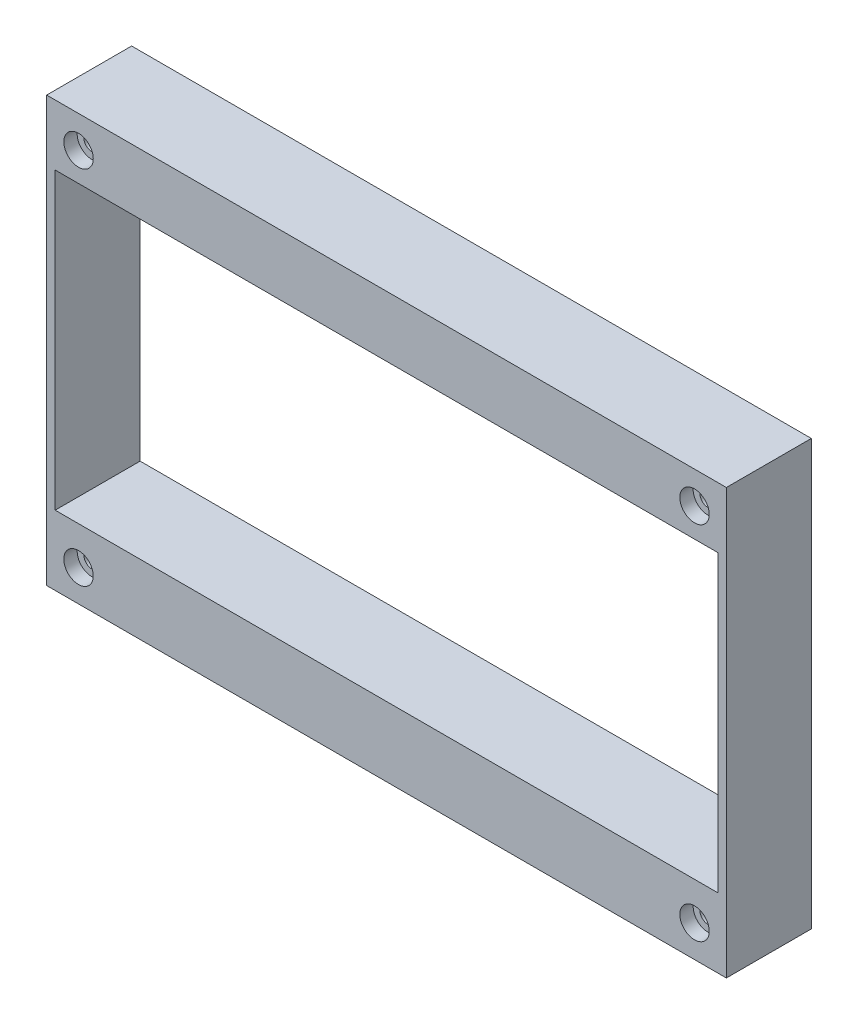
ISO-10303-21;
HEADER;
FILE_DESCRIPTION(('STEP AP214'),'2;1');
FILE_NAME('part.step','',(''),(''),'','','');
FILE_SCHEMA(('AUTOMOTIVE_DESIGN { 1 0 10303 214 1 1 1 1 }'));
ENDSEC;
DATA;
#1=APPLICATION_CONTEXT('core data for automotive mechanical design processes');
#2=APPLICATION_PROTOCOL_DEFINITION('international standard','automotive_design',2000,#1);
#3=PRODUCT_CONTEXT('',#1,'mechanical');
#4=PRODUCT('Part','Part','',(#3));
#5=PRODUCT_RELATED_PRODUCT_CATEGORY('part','',(#4));
#6=PRODUCT_DEFINITION_FORMATION('','',#4);
#7=PRODUCT_DEFINITION_CONTEXT('part definition',#1,'design');
#8=PRODUCT_DEFINITION('design','',#6,#7);
#9=PRODUCT_DEFINITION_SHAPE('','',#8);
#10=(LENGTH_UNIT() NAMED_UNIT(*) SI_UNIT(.MILLI.,.METRE.));
#11=(NAMED_UNIT(*) PLANE_ANGLE_UNIT() SI_UNIT($,.RADIAN.));
#12=(NAMED_UNIT(*) SI_UNIT($,.STERADIAN.) SOLID_ANGLE_UNIT());
#13=UNCERTAINTY_MEASURE_WITH_UNIT(LENGTH_MEASURE(1.E-05),#10,'distance_accuracy_value','');
#14=(GEOMETRIC_REPRESENTATION_CONTEXT(3) GLOBAL_UNCERTAINTY_ASSIGNED_CONTEXT((#13)) GLOBAL_UNIT_ASSIGNED_CONTEXT((#10,
#11,#12)) REPRESENTATION_CONTEXT('',''));
#15=CARTESIAN_POINT('',(0.,0.,0.));
#16=DIRECTION('',(0.,0.,1.));
#17=DIRECTION('',(1.,0.,0.));
#18=AXIS2_PLACEMENT_3D('',#15,#16,#17);
#19=CARTESIAN_POINT('',(0.,63.5,12.7));
#20=DIRECTION('',(0.,1.,0.));
#21=DIRECTION('',(0.,0.,1.));
#22=AXIS2_PLACEMENT_3D('',#19,#20,#21);
#23=PLANE('',#22);
#24=DIRECTION('',(1.,0.,0.));
#25=VECTOR('',#24,1.);
#26=CARTESIAN_POINT('',(0.,63.5,0.));
#27=LINE('',#26,#25);
#28=CARTESIAN_POINT('',(0.,63.5,0.));
#29=VERTEX_POINT('',#28);
#30=CARTESIAN_POINT('',(101.6,63.5,0.));
#31=VERTEX_POINT('',#30);
#32=EDGE_CURVE('E152',#29,#31,#27,.T.);
#33=ORIENTED_EDGE('',*,*,#32,.F.);
#34=DIRECTION('',(0.,0.,-1.));
#35=VECTOR('',#34,1.);
#36=CARTESIAN_POINT('',(0.,63.5,12.7));
#37=LINE('',#36,#35);
#38=CARTESIAN_POINT('',(0.,63.5,12.7));
#39=VERTEX_POINT('',#38);
#40=EDGE_CURVE('E11',#39,#29,#37,.T.);
#41=ORIENTED_EDGE('',*,*,#40,.F.);
#42=DIRECTION('',(1.,0.,0.));
#43=VECTOR('',#42,1.);
#44=CARTESIAN_POINT('',(0.,63.5,12.7));
#45=LINE('',#44,#43);
#46=CARTESIAN_POINT('',(101.6,63.5,12.7));
#47=VERTEX_POINT('',#46);
#48=EDGE_CURVE('E158',#39,#47,#45,.T.);
#49=ORIENTED_EDGE('',*,*,#48,.T.);
#50=DIRECTION('',(0.,0.,-1.));
#51=VECTOR('',#50,1.);
#52=CARTESIAN_POINT('',(101.6,63.5,12.7));
#53=LINE('',#52,#51);
#54=EDGE_CURVE('E173',#47,#31,#53,.T.);
#55=ORIENTED_EDGE('',*,*,#54,.T.);
#56=EDGE_LOOP('',(#33,#41,#49,#55));
#57=FACE_BOUND('',#56,.T.);
#58=ADVANCED_FACE('F39',(#57),#23,.T.);
#59=CARTESIAN_POINT('',(0.,0.,12.7));
#60=DIRECTION('',(-1.,0.,0.));
#61=DIRECTION('',(0.,0.,1.));
#62=AXIS2_PLACEMENT_3D('',#59,#60,#61);
#63=PLANE('',#62);
#64=DIRECTION('',(0.,1.,0.));
#65=VECTOR('',#64,1.);
#66=CARTESIAN_POINT('',(0.,0.,0.));
#67=LINE('',#66,#65);
#68=CARTESIAN_POINT('',(0.,0.,0.));
#69=VERTEX_POINT('',#68);
#70=EDGE_CURVE('E163',#69,#29,#67,.T.);
#71=ORIENTED_EDGE('',*,*,#70,.F.);
#72=DIRECTION('',(0.,0.,-1.));
#73=VECTOR('',#72,1.);
#74=CARTESIAN_POINT('',(0.,0.,12.7));
#75=LINE('',#74,#73);
#76=CARTESIAN_POINT('',(0.,0.,12.7));
#77=VERTEX_POINT('',#76);
#78=EDGE_CURVE('E48',#77,#69,#75,.T.);
#79=ORIENTED_EDGE('',*,*,#78,.F.);
#80=DIRECTION('',(0.,1.,0.));
#81=VECTOR('',#80,1.);
#82=CARTESIAN_POINT('',(0.,0.,12.7));
#83=LINE('',#82,#81);
#84=EDGE_CURVE('E169',#77,#39,#83,.T.);
#85=ORIENTED_EDGE('',*,*,#84,.T.);
#86=ORIENTED_EDGE('',*,*,#40,.T.);
#87=EDGE_LOOP('',(#71,#79,#85,#86));
#88=FACE_BOUND('',#87,.T.);
#89=ADVANCED_FACE('F294',(#88),#63,.T.);
#90=CARTESIAN_POINT('',(0.,0.,12.7));
#91=DIRECTION('',(0.,1.,0.));
#92=DIRECTION('',(0.,0.,1.));
#93=AXIS2_PLACEMENT_3D('',#90,#91,#92);
#94=PLANE('',#93);
#95=DIRECTION('',(1.,0.,0.));
#96=VECTOR('',#95,1.);
#97=CARTESIAN_POINT('',(0.,0.,0.));
#98=LINE('',#97,#96);
#99=CARTESIAN_POINT('',(101.6,0.,0.));
#100=VERTEX_POINT('',#99);
#101=EDGE_CURVE('E181',#69,#100,#98,.T.);
#102=ORIENTED_EDGE('',*,*,#101,.T.);
#103=DIRECTION('',(0.,0.,-1.));
#104=VECTOR('',#103,1.);
#105=CARTESIAN_POINT('',(101.6,0.,12.7));
#106=LINE('',#105,#104);
#107=CARTESIAN_POINT('',(101.6,0.,12.7));
#108=VERTEX_POINT('',#107);
#109=EDGE_CURVE('E189',#108,#100,#106,.T.);
#110=ORIENTED_EDGE('',*,*,#109,.F.);
#111=DIRECTION('',(1.,0.,0.));
#112=VECTOR('',#111,1.);
#113=CARTESIAN_POINT('',(0.,0.,12.7));
#114=LINE('',#113,#112);
#115=EDGE_CURVE('E166',#77,#108,#114,.T.);
#116=ORIENTED_EDGE('',*,*,#115,.F.);
#117=ORIENTED_EDGE('',*,*,#78,.T.);
#118=EDGE_LOOP('',(#102,#110,#116,#117));
#119=FACE_BOUND('',#118,.T.);
#120=ADVANCED_FACE('F299',(#119),#94,.F.);
#121=CARTESIAN_POINT('',(101.6,0.,12.7));
#122=DIRECTION('',(-1.,0.,0.));
#123=DIRECTION('',(0.,0.,1.));
#124=AXIS2_PLACEMENT_3D('',#121,#122,#123);
#125=PLANE('',#124);
#126=DIRECTION('',(0.,1.,0.));
#127=VECTOR('',#126,1.);
#128=CARTESIAN_POINT('',(101.6,0.,0.));
#129=LINE('',#128,#127);
#130=EDGE_CURVE('E177',#100,#31,#129,.T.);
#131=ORIENTED_EDGE('',*,*,#130,.T.);
#132=ORIENTED_EDGE('',*,*,#54,.F.);
#133=DIRECTION('',(0.,1.,0.));
#134=VECTOR('',#133,1.);
#135=CARTESIAN_POINT('',(101.6,0.,12.7));
#136=LINE('',#135,#134);
#137=EDGE_CURVE('E162',#108,#47,#136,.T.);
#138=ORIENTED_EDGE('',*,*,#137,.F.);
#139=ORIENTED_EDGE('',*,*,#109,.T.);
#140=EDGE_LOOP('',(#131,#132,#138,#139));
#141=FACE_BOUND('',#140,.T.);
#142=ADVANCED_FACE('F287',(#141),#125,.F.);
#143=CARTESIAN_POINT('',(0.,0.,12.7));
#144=DIRECTION('',(0.,0.,1.));
#145=DIRECTION('',(1.,0.,0.));
#146=AXIS2_PLACEMENT_3D('',#143,#144,#145);
#147=PLANE('',#146);
#148=CARTESIAN_POINT('',(96.8375,4.7625,12.7));
#149=DIRECTION('',(0.,0.,1.));
#150=DIRECTION('',(1.,0.,0.));
#151=AXIS2_PLACEMENT_3D('',#148,#149,#150);
#152=CIRCLE('',#151,2.19999999999999);
#153=CARTESIAN_POINT('',(99.0375,4.7625,12.7));
#154=VERTEX_POINT('',#153);
#155=EDGE_CURVE('E582',#154,#154,#152,.T.);
#156=ORIENTED_EDGE('',*,*,#155,.F.);
#157=EDGE_LOOP('',(#156));
#158=FACE_BOUND('',#157,.T.);
#159=CARTESIAN_POINT('',(96.8375,58.7375,12.7));
#160=DIRECTION('',(0.,0.,1.));
#161=DIRECTION('',(1.,0.,0.));
#162=AXIS2_PLACEMENT_3D('',#159,#160,#161);
#163=CIRCLE('',#162,2.19999999999999);
#164=CARTESIAN_POINT('',(99.0375,58.7375,12.7));
#165=VERTEX_POINT('',#164);
#166=EDGE_CURVE('E225',#165,#165,#163,.T.);
#167=ORIENTED_EDGE('',*,*,#166,.F.);
#168=EDGE_LOOP('',(#167));
#169=FACE_BOUND('',#168,.T.);
#170=CARTESIAN_POINT('',(4.76249999999999,58.7375,12.7));
#171=DIRECTION('',(0.,0.,1.));
#172=DIRECTION('',(1.,0.,0.));
#173=AXIS2_PLACEMENT_3D('',#170,#171,#172);
#174=CIRCLE('',#173,2.19999999999999);
#175=CARTESIAN_POINT('',(6.96249999999998,58.7375,12.7));
#176=VERTEX_POINT('',#175);
#177=EDGE_CURVE('E209',#176,#176,#174,.T.);
#178=ORIENTED_EDGE('',*,*,#177,.F.);
#179=EDGE_LOOP('',(#178));
#180=FACE_BOUND('',#179,.T.);
#181=CARTESIAN_POINT('',(4.76249999999999,4.71678,12.7));
#182=DIRECTION('',(0.,0.,1.));
#183=DIRECTION('',(1.,0.,0.));
#184=AXIS2_PLACEMENT_3D('',#181,#182,#183);
#185=CIRCLE('',#184,2.19999999999999);
#186=CARTESIAN_POINT('',(6.96249999999998,4.71678,12.7));
#187=VERTEX_POINT('',#186);
#188=EDGE_CURVE('E204',#187,#187,#185,.T.);
#189=ORIENTED_EDGE('',*,*,#188,.F.);
#190=EDGE_LOOP('',(#189));
#191=FACE_BOUND('',#190,.T.);
#192=DIRECTION('',(0.,-1.,0.));
#193=VECTOR('',#192,1.);
#194=CARTESIAN_POINT('',(1.27,54.4313502245366,12.7));
#195=LINE('',#194,#193);
#196=CARTESIAN_POINT('',(1.27,54.4313502245366,12.7));
#197=VERTEX_POINT('',#196);
#198=CARTESIAN_POINT('',(1.27000000000001,10.3954701748501,12.7));
#199=VERTEX_POINT('',#198);
#200=EDGE_CURVE('E56',#197,#199,#195,.T.);
#201=ORIENTED_EDGE('',*,*,#200,.F.);
#202=DIRECTION('',(-1.,0.,0.));
#203=VECTOR('',#202,1.);
#204=CARTESIAN_POINT('',(1.27,54.4313502245366,12.7));
#205=LINE('',#204,#203);
#206=CARTESIAN_POINT('',(100.33,54.4313502245366,12.7));
#207=VERTEX_POINT('',#206);
#208=EDGE_CURVE('E126',#207,#197,#205,.T.);
#209=ORIENTED_EDGE('',*,*,#208,.F.);
#210=DIRECTION('',(0.,1.,0.));
#211=VECTOR('',#210,1.);
#212=CARTESIAN_POINT('',(100.33,54.4313502245366,12.7));
#213=LINE('',#212,#211);
#214=CARTESIAN_POINT('',(100.33,10.3954701748501,12.7));
#215=VERTEX_POINT('',#214);
#216=EDGE_CURVE('E130',#215,#207,#213,.T.);
#217=ORIENTED_EDGE('',*,*,#216,.F.);
#218=DIRECTION('',(1.,0.,0.));
#219=VECTOR('',#218,1.);
#220=CARTESIAN_POINT('',(1.27000000000001,10.3954701748501,12.7));
#221=LINE('',#220,#219);
#222=EDGE_CURVE('E142',#199,#215,#221,.T.);
#223=ORIENTED_EDGE('',*,*,#222,.F.);
#224=EDGE_LOOP('',(#201,#209,#217,#223));
#225=FACE_BOUND('',#224,.T.);
#226=ORIENTED_EDGE('',*,*,#48,.F.);
#227=ORIENTED_EDGE('',*,*,#84,.F.);
#228=ORIENTED_EDGE('',*,*,#115,.T.);
#229=ORIENTED_EDGE('',*,*,#137,.T.);
#230=EDGE_LOOP('',(#226,#227,#228,#229));
#231=FACE_BOUND('',#230,.T.);
#232=ADVANCED_FACE('F278',(#158,#169,#180,#191,#225,#231),#147,.T.);
#233=CARTESIAN_POINT('',(0.,0.,0.));
#234=DIRECTION('',(0.,0.,1.));
#235=DIRECTION('',(1.,0.,0.));
#236=AXIS2_PLACEMENT_3D('',#233,#234,#235);
#237=PLANE('',#236);
#238=CARTESIAN_POINT('',(4.76249999999999,4.7625,0.));
#239=DIRECTION('',(0.,0.,-1.));
#240=DIRECTION('',(-1.,0.,0.));
#241=AXIS2_PLACEMENT_3D('',#238,#239,#240);
#242=CIRCLE('',#241,1.5875);
#243=CARTESIAN_POINT('',(3.17499999999999,4.7625,0.));
#244=VERTEX_POINT('',#243);
#245=EDGE_CURVE('E199',#244,#244,#242,.T.);
#246=ORIENTED_EDGE('',*,*,#245,.F.);
#247=EDGE_LOOP('',(#246));
#248=FACE_BOUND('',#247,.T.);
#249=CARTESIAN_POINT('',(4.76249999999999,58.7375,0.));
#250=DIRECTION('',(0.,0.,-1.));
#251=DIRECTION('',(-1.,0.,0.));
#252=AXIS2_PLACEMENT_3D('',#249,#250,#251);
#253=CIRCLE('',#252,1.5875);
#254=CARTESIAN_POINT('',(3.17499999999999,58.7375,0.));
#255=VERTEX_POINT('',#254);
#256=EDGE_CURVE('E257',#255,#255,#253,.T.);
#257=ORIENTED_EDGE('',*,*,#256,.F.);
#258=EDGE_LOOP('',(#257));
#259=FACE_BOUND('',#258,.T.);
#260=CARTESIAN_POINT('',(96.8375,58.7375,0.));
#261=DIRECTION('',(0.,0.,-1.));
#262=DIRECTION('',(-1.,0.,0.));
#263=AXIS2_PLACEMENT_3D('',#260,#261,#262);
#264=CIRCLE('',#263,1.5875);
#265=CARTESIAN_POINT('',(95.25,58.7375,0.));
#266=VERTEX_POINT('',#265);
#267=EDGE_CURVE('E249',#266,#266,#264,.T.);
#268=ORIENTED_EDGE('',*,*,#267,.F.);
#269=EDGE_LOOP('',(#268));
#270=FACE_BOUND('',#269,.T.);
#271=CARTESIAN_POINT('',(96.8375,4.7625,0.));
#272=DIRECTION('',(0.,0.,-1.));
#273=DIRECTION('',(-1.,0.,0.));
#274=AXIS2_PLACEMENT_3D('',#271,#272,#273);
#275=CIRCLE('',#274,1.5875);
#276=CARTESIAN_POINT('',(95.25,4.7625,0.));
#277=VERTEX_POINT('',#276);
#278=EDGE_CURVE('E133',#277,#277,#275,.T.);
#279=ORIENTED_EDGE('',*,*,#278,.F.);
#280=EDGE_LOOP('',(#279));
#281=FACE_BOUND('',#280,.T.);
#282=DIRECTION('',(-1.,0.,0.));
#283=VECTOR('',#282,1.);
#284=CARTESIAN_POINT('',(1.27,54.4313502245366,0.));
#285=LINE('',#284,#283);
#286=CARTESIAN_POINT('',(100.33,54.4313502245366,0.));
#287=VERTEX_POINT('',#286);
#288=CARTESIAN_POINT('',(1.27,54.4313502245366,0.));
#289=VERTEX_POINT('',#288);
#290=EDGE_CURVE('E114',#287,#289,#285,.T.);
#291=ORIENTED_EDGE('',*,*,#290,.T.);
#292=DIRECTION('',(0.,-1.,0.));
#293=VECTOR('',#292,1.);
#294=CARTESIAN_POINT('',(1.27,54.4313502245366,0.));
#295=LINE('',#294,#293);
#296=CARTESIAN_POINT('',(1.27000000000001,10.3954701748501,0.));
#297=VERTEX_POINT('',#296);
#298=EDGE_CURVE('E107',#289,#297,#295,.T.);
#299=ORIENTED_EDGE('',*,*,#298,.T.);
#300=DIRECTION('',(1.,0.,0.));
#301=VECTOR('',#300,1.);
#302=CARTESIAN_POINT('',(1.27000000000001,10.3954701748501,0.));
#303=LINE('',#302,#301);
#304=CARTESIAN_POINT('',(100.33,10.3954701748501,0.));
#305=VERTEX_POINT('',#304);
#306=EDGE_CURVE('E117',#297,#305,#303,.T.);
#307=ORIENTED_EDGE('',*,*,#306,.T.);
#308=DIRECTION('',(0.,1.,0.));
#309=VECTOR('',#308,1.);
#310=CARTESIAN_POINT('',(100.33,54.4313502245366,0.));
#311=LINE('',#310,#309);
#312=EDGE_CURVE('E64',#305,#287,#311,.T.);
#313=ORIENTED_EDGE('',*,*,#312,.T.);
#314=EDGE_LOOP('',(#291,#299,#307,#313));
#315=FACE_BOUND('',#314,.T.);
#316=ORIENTED_EDGE('',*,*,#32,.T.);
#317=ORIENTED_EDGE('',*,*,#130,.F.);
#318=ORIENTED_EDGE('',*,*,#101,.F.);
#319=ORIENTED_EDGE('',*,*,#70,.T.);
#320=EDGE_LOOP('',(#316,#317,#318,#319));
#321=FACE_BOUND('',#320,.T.);
#322=ADVANCED_FACE('F122',(#248,#259,#270,#281,#315,#321),#237,.F.);
#323=CARTESIAN_POINT('',(1.27,54.4313502245366,0.));
#324=DIRECTION('',(-1.,0.,0.));
#325=DIRECTION('',(0.,-1.,0.));
#326=AXIS2_PLACEMENT_3D('',#323,#324,#325);
#327=PLANE('',#326);
#328=ORIENTED_EDGE('',*,*,#200,.T.);
#329=DIRECTION('',(0.,0.,1.));
#330=VECTOR('',#329,1.);
#331=CARTESIAN_POINT('',(1.27000000000001,10.3954701748501,0.));
#332=LINE('',#331,#330);
#333=EDGE_CURVE('E103',#297,#199,#332,.T.);
#334=ORIENTED_EDGE('',*,*,#333,.F.);
#335=ORIENTED_EDGE('',*,*,#298,.F.);
#336=DIRECTION('',(0.,0.,1.));
#337=VECTOR('',#336,1.);
#338=CARTESIAN_POINT('',(1.27,54.4313502245366,0.));
#339=LINE('',#338,#337);
#340=EDGE_CURVE('E149',#289,#197,#339,.T.);
#341=ORIENTED_EDGE('',*,*,#340,.T.);
#342=EDGE_LOOP('',(#328,#334,#335,#341));
#343=FACE_BOUND('',#342,.T.);
#344=ADVANCED_FACE('F105',(#343),#327,.F.);
#345=CARTESIAN_POINT('',(1.27,54.4313502245366,0.));
#346=DIRECTION('',(0.,1.,0.));
#347=DIRECTION('',(0.,0.,1.));
#348=AXIS2_PLACEMENT_3D('',#345,#346,#347);
#349=PLANE('',#348);
#350=ORIENTED_EDGE('',*,*,#208,.T.);
#351=ORIENTED_EDGE('',*,*,#340,.F.);
#352=ORIENTED_EDGE('',*,*,#290,.F.);
#353=DIRECTION('',(0.,0.,1.));
#354=VECTOR('',#353,1.);
#355=CARTESIAN_POINT('',(100.33,54.4313502245366,0.));
#356=LINE('',#355,#354);
#357=EDGE_CURVE('E153',#287,#207,#356,.T.);
#358=ORIENTED_EDGE('',*,*,#357,.T.);
#359=EDGE_LOOP('',(#350,#351,#352,#358));
#360=FACE_BOUND('',#359,.T.);
#361=ADVANCED_FACE('F285',(#360),#349,.F.);
#362=CARTESIAN_POINT('',(100.33,54.4313502245366,0.));
#363=DIRECTION('',(1.,0.,0.));
#364=DIRECTION('',(0.,0.,-1.));
#365=AXIS2_PLACEMENT_3D('',#362,#363,#364);
#366=PLANE('',#365);
#367=ORIENTED_EDGE('',*,*,#216,.T.);
#368=ORIENTED_EDGE('',*,*,#357,.F.);
#369=ORIENTED_EDGE('',*,*,#312,.F.);
#370=DIRECTION('',(0.,0.,1.));
#371=VECTOR('',#370,1.);
#372=CARTESIAN_POINT('',(100.33,10.3954701748501,0.));
#373=LINE('',#372,#371);
#374=EDGE_CURVE('E113',#305,#215,#373,.T.);
#375=ORIENTED_EDGE('',*,*,#374,.T.);
#376=EDGE_LOOP('',(#367,#368,#369,#375));
#377=FACE_BOUND('',#376,.T.);
#378=ADVANCED_FACE('F517',(#377),#366,.F.);
#379=CARTESIAN_POINT('',(1.27000000000001,10.3954701748501,0.));
#380=DIRECTION('',(0.,-1.,0.));
#381=DIRECTION('',(0.,0.,-1.));
#382=AXIS2_PLACEMENT_3D('',#379,#380,#381);
#383=PLANE('',#382);
#384=ORIENTED_EDGE('',*,*,#222,.T.);
#385=ORIENTED_EDGE('',*,*,#374,.F.);
#386=ORIENTED_EDGE('',*,*,#306,.F.);
#387=ORIENTED_EDGE('',*,*,#333,.T.);
#388=EDGE_LOOP('',(#384,#385,#386,#387));
#389=FACE_BOUND('',#388,.T.);
#390=ADVANCED_FACE('F118',(#389),#383,.F.);
#391=CARTESIAN_POINT('',(96.8375,4.7625,3.175));
#392=DIRECTION('',(0.,0.,-1.));
#393=DIRECTION('',(-1.,0.,0.));
#394=AXIS2_PLACEMENT_3D('',#391,#392,#393);
#395=CYLINDRICAL_SURFACE('',#394,1.5875);
#396=CARTESIAN_POINT('',(96.8375,4.7625,3.175));
#397=DIRECTION('',(0.,0.,-1.));
#398=DIRECTION('',(-1.,0.,0.));
#399=AXIS2_PLACEMENT_3D('',#396,#397,#398);
#400=CIRCLE('',#399,1.5875);
#401=CARTESIAN_POINT('',(95.25,4.7625,3.175));
#402=VERTEX_POINT('',#401);
#403=EDGE_CURVE('E143',#402,#402,#400,.T.);
#404=ORIENTED_EDGE('',*,*,#403,.F.);
#405=EDGE_LOOP('',(#404));
#406=FACE_BOUND('',#405,.T.);
#407=ORIENTED_EDGE('',*,*,#278,.T.);
#408=EDGE_LOOP('',(#407));
#409=FACE_BOUND('',#408,.T.);
#410=ADVANCED_FACE('F275',(#406,#409),#395,.F.);
#411=CARTESIAN_POINT('',(96.8375,4.7625,3.175));
#412=DIRECTION('',(0.,0.,-1.));
#413=DIRECTION('',(-1.,0.,0.));
#414=AXIS2_PLACEMENT_3D('',#411,#412,#413);
#415=PLANE('',#414);
#416=CARTESIAN_POINT('',(96.8375,4.7625,3.175));
#417=DIRECTION('',(0.,0.,-1.));
#418=DIRECTION('',(-1.,0.,0.));
#419=AXIS2_PLACEMENT_3D('',#416,#417,#418);
#420=CIRCLE('',#419,1.19999999999999);
#421=CARTESIAN_POINT('',(95.6375,4.7625,3.175));
#422=VERTEX_POINT('',#421);
#423=EDGE_CURVE('E42',#422,#422,#420,.T.);
#424=ORIENTED_EDGE('',*,*,#423,.F.);
#425=EDGE_LOOP('',(#424));
#426=FACE_BOUND('',#425,.T.);
#427=ORIENTED_EDGE('',*,*,#403,.T.);
#428=EDGE_LOOP('',(#427));
#429=FACE_BOUND('',#428,.T.);
#430=ADVANCED_FACE('F338',(#426,#429),#415,.T.);
#431=CARTESIAN_POINT('',(96.8375,58.7375,3.175));
#432=DIRECTION('',(0.,0.,-1.));
#433=DIRECTION('',(-1.,0.,0.));
#434=AXIS2_PLACEMENT_3D('',#431,#432,#433);
#435=CYLINDRICAL_SURFACE('',#434,1.5875);
#436=CARTESIAN_POINT('',(96.8375,58.7375,3.175));
#437=DIRECTION('',(0.,0.,-1.));
#438=DIRECTION('',(-1.,0.,0.));
#439=AXIS2_PLACEMENT_3D('',#436,#437,#438);
#440=CIRCLE('',#439,1.5875);
#441=CARTESIAN_POINT('',(95.25,58.7375,3.175));
#442=VERTEX_POINT('',#441);
#443=EDGE_CURVE('E245',#442,#442,#440,.T.);
#444=ORIENTED_EDGE('',*,*,#443,.F.);
#445=EDGE_LOOP('',(#444));
#446=FACE_BOUND('',#445,.T.);
#447=ORIENTED_EDGE('',*,*,#267,.T.);
#448=EDGE_LOOP('',(#447));
#449=FACE_BOUND('',#448,.T.);
#450=ADVANCED_FACE('F343',(#446,#449),#435,.F.);
#451=CARTESIAN_POINT('',(96.8375,58.7375,3.175));
#452=DIRECTION('',(0.,0.,-1.));
#453=DIRECTION('',(-1.,0.,0.));
#454=AXIS2_PLACEMENT_3D('',#451,#452,#453);
#455=PLANE('',#454);
#456=CARTESIAN_POINT('',(96.8375,58.7375,3.175));
#457=DIRECTION('',(0.,0.,-1.));
#458=DIRECTION('',(-1.,0.,0.));
#459=AXIS2_PLACEMENT_3D('',#456,#457,#458);
#460=CIRCLE('',#459,1.19999999999999);
#461=CARTESIAN_POINT('',(95.6375,58.7375,3.175));
#462=VERTEX_POINT('',#461);
#463=EDGE_CURVE('E206',#462,#462,#460,.T.);
#464=ORIENTED_EDGE('',*,*,#463,.F.);
#465=EDGE_LOOP('',(#464));
#466=FACE_BOUND('',#465,.T.);
#467=ORIENTED_EDGE('',*,*,#443,.T.);
#468=EDGE_LOOP('',(#467));
#469=FACE_BOUND('',#468,.T.);
#470=ADVANCED_FACE('F353',(#466,#469),#455,.T.);
#471=CARTESIAN_POINT('',(4.76249999999999,58.7375,3.175));
#472=DIRECTION('',(0.,0.,-1.));
#473=DIRECTION('',(-1.,0.,0.));
#474=AXIS2_PLACEMENT_3D('',#471,#472,#473);
#475=CYLINDRICAL_SURFACE('',#474,1.5875);
#476=CARTESIAN_POINT('',(4.76249999999999,58.7375,3.175));
#477=DIRECTION('',(0.,0.,-1.));
#478=DIRECTION('',(-1.,0.,0.));
#479=AXIS2_PLACEMENT_3D('',#476,#477,#478);
#480=CIRCLE('',#479,1.5875);
#481=CARTESIAN_POINT('',(3.17499999999999,58.7375,3.175));
#482=VERTEX_POINT('',#481);
#483=EDGE_CURVE('E253',#482,#482,#480,.T.);
#484=ORIENTED_EDGE('',*,*,#483,.F.);
#485=EDGE_LOOP('',(#484));
#486=FACE_BOUND('',#485,.T.);
#487=ORIENTED_EDGE('',*,*,#256,.T.);
#488=EDGE_LOOP('',(#487));
#489=FACE_BOUND('',#488,.T.);
#490=ADVANCED_FACE('F358',(#486,#489),#475,.F.);
#491=CARTESIAN_POINT('',(4.76249999999999,58.7375,3.175));
#492=DIRECTION('',(0.,0.,-1.));
#493=DIRECTION('',(-1.,0.,0.));
#494=AXIS2_PLACEMENT_3D('',#491,#492,#493);
#495=PLANE('',#494);
#496=CARTESIAN_POINT('',(4.76249999999999,58.7375,3.175));
#497=DIRECTION('',(0.,0.,-1.));
#498=DIRECTION('',(-1.,0.,0.));
#499=AXIS2_PLACEMENT_3D('',#496,#497,#498);
#500=CIRCLE('',#499,1.2);
#501=CARTESIAN_POINT('',(3.56249999999999,58.7375,3.175));
#502=VERTEX_POINT('',#501);
#503=EDGE_CURVE('E201',#502,#502,#500,.T.);
#504=ORIENTED_EDGE('',*,*,#503,.F.);
#505=EDGE_LOOP('',(#504));
#506=FACE_BOUND('',#505,.T.);
#507=ORIENTED_EDGE('',*,*,#483,.T.);
#508=EDGE_LOOP('',(#507));
#509=FACE_BOUND('',#508,.T.);
#510=ADVANCED_FACE('F366',(#506,#509),#495,.T.);
#511=CARTESIAN_POINT('',(4.76249999999999,4.7625,3.175));
#512=DIRECTION('',(0.,0.,-1.));
#513=DIRECTION('',(-1.,0.,0.));
#514=AXIS2_PLACEMENT_3D('',#511,#512,#513);
#515=CYLINDRICAL_SURFACE('',#514,1.5875);
#516=CARTESIAN_POINT('',(4.76249999999999,4.7625,3.175));
#517=DIRECTION('',(0.,0.,-1.));
#518=DIRECTION('',(-1.,0.,0.));
#519=AXIS2_PLACEMENT_3D('',#516,#517,#518);
#520=CIRCLE('',#519,1.5875);
#521=CARTESIAN_POINT('',(3.17499999999999,4.7625,3.175));
#522=VERTEX_POINT('',#521);
#523=EDGE_CURVE('E261',#522,#522,#520,.T.);
#524=ORIENTED_EDGE('',*,*,#523,.F.);
#525=EDGE_LOOP('',(#524));
#526=FACE_BOUND('',#525,.T.);
#527=ORIENTED_EDGE('',*,*,#245,.T.);
#528=EDGE_LOOP('',(#527));
#529=FACE_BOUND('',#528,.T.);
#530=ADVANCED_FACE('F333',(#526,#529),#515,.F.);
#531=CARTESIAN_POINT('',(4.76249999999999,4.7625,3.175));
#532=DIRECTION('',(0.,0.,-1.));
#533=DIRECTION('',(-1.,0.,0.));
#534=AXIS2_PLACEMENT_3D('',#531,#532,#533);
#535=PLANE('',#534);
#536=CARTESIAN_POINT('',(4.76249999999999,4.71678,3.175));
#537=DIRECTION('',(0.,0.,-1.));
#538=DIRECTION('',(-1.,0.,0.));
#539=AXIS2_PLACEMENT_3D('',#536,#537,#538);
#540=CIRCLE('',#539,1.2);
#541=CARTESIAN_POINT('',(3.56249999999999,4.71678,3.175));
#542=VERTEX_POINT('',#541);
#543=EDGE_CURVE('E195',#542,#542,#540,.T.);
#544=ORIENTED_EDGE('',*,*,#543,.F.);
#545=EDGE_LOOP('',(#544));
#546=FACE_BOUND('',#545,.T.);
#547=ORIENTED_EDGE('',*,*,#523,.T.);
#548=EDGE_LOOP('',(#547));
#549=FACE_BOUND('',#548,.T.);
#550=ADVANCED_FACE('F376',(#546,#549),#535,.T.);
#551=CARTESIAN_POINT('',(4.76249999999999,4.71678,12.7));
#552=DIRECTION('',(0.,0.,1.));
#553=DIRECTION('',(1.,0.,0.));
#554=AXIS2_PLACEMENT_3D('',#551,#552,#553);
#555=CYLINDRICAL_SURFACE('',#554,1.2);
#556=ORIENTED_EDGE('',*,*,#543,.T.);
#557=EDGE_LOOP('',(#556));
#558=FACE_BOUND('',#557,.T.);
#559=CARTESIAN_POINT('',(4.76249999999999,4.71678,10.7));
#560=DIRECTION('',(0.,0.,1.));
#561=DIRECTION('',(1.,0.,0.));
#562=AXIS2_PLACEMENT_3D('',#559,#560,#561);
#563=CIRCLE('',#562,1.2);
#564=CARTESIAN_POINT('',(5.96249999999999,4.71678,10.7));
#565=VERTEX_POINT('',#564);
#566=EDGE_CURVE('E200',#565,#565,#563,.T.);
#567=ORIENTED_EDGE('',*,*,#566,.T.);
#568=EDGE_LOOP('',(#567));
#569=FACE_BOUND('',#568,.T.);
#570=ADVANCED_FACE('F381',(#558,#569),#555,.F.);
#571=CARTESIAN_POINT('',(5.96249999999999,4.71678,10.7));
#572=DIRECTION('',(0.,0.,-1.));
#573=DIRECTION('',(-1.,0.,0.));
#574=AXIS2_PLACEMENT_3D('',#571,#572,#573);
#575=PLANE('',#574);
#576=ORIENTED_EDGE('',*,*,#566,.F.);
#577=EDGE_LOOP('',(#576));
#578=FACE_BOUND('',#577,.T.);
#579=CARTESIAN_POINT('',(4.76249999999999,4.71678,10.7));
#580=DIRECTION('',(0.,0.,1.));
#581=DIRECTION('',(1.,0.,0.));
#582=AXIS2_PLACEMENT_3D('',#579,#580,#581);
#583=CIRCLE('',#582,2.2);
#584=CARTESIAN_POINT('',(6.96249999999999,4.71678,10.7));
#585=VERTEX_POINT('',#584);
#586=EDGE_CURVE('E238',#585,#585,#583,.T.);
#587=ORIENTED_EDGE('',*,*,#586,.T.);
#588=EDGE_LOOP('',(#587));
#589=FACE_BOUND('',#588,.T.);
#590=ADVANCED_FACE('F391',(#578,#589),#575,.F.);
#591=CARTESIAN_POINT('',(4.76249999999999,4.71678,12.7));
#592=DIRECTION('',(0.,0.,1.));
#593=DIRECTION('',(1.,0.,0.));
#594=AXIS2_PLACEMENT_3D('',#591,#592,#593);
#595=CYLINDRICAL_SURFACE('',#594,2.19999999999999);
#596=ORIENTED_EDGE('',*,*,#586,.F.);
#597=EDGE_LOOP('',(#596));
#598=FACE_BOUND('',#597,.T.);
#599=ORIENTED_EDGE('',*,*,#188,.T.);
#600=EDGE_LOOP('',(#599));
#601=FACE_BOUND('',#600,.T.);
#602=ADVANCED_FACE('F401',(#598,#601),#595,.F.);
#603=CARTESIAN_POINT('',(4.76249999999999,58.7375,12.7));
#604=DIRECTION('',(0.,0.,1.));
#605=DIRECTION('',(1.,0.,0.));
#606=AXIS2_PLACEMENT_3D('',#603,#604,#605);
#607=CYLINDRICAL_SURFACE('',#606,1.2);
#608=ORIENTED_EDGE('',*,*,#503,.T.);
#609=EDGE_LOOP('',(#608));
#610=FACE_BOUND('',#609,.T.);
#611=CARTESIAN_POINT('',(4.76249999999999,58.7375,10.7));
#612=DIRECTION('',(0.,0.,1.));
#613=DIRECTION('',(1.,0.,0.));
#614=AXIS2_PLACEMENT_3D('',#611,#612,#613);
#615=CIRCLE('',#614,1.2);
#616=CARTESIAN_POINT('',(5.96249999999999,58.7375,10.7));
#617=VERTEX_POINT('',#616);
#618=EDGE_CURVE('E205',#617,#617,#615,.T.);
#619=ORIENTED_EDGE('',*,*,#618,.T.);
#620=EDGE_LOOP('',(#619));
#621=FACE_BOUND('',#620,.T.);
#622=ADVANCED_FACE('F411',(#610,#621),#607,.F.);
#623=CARTESIAN_POINT('',(5.96249999999999,58.7375,10.7));
#624=DIRECTION('',(0.,0.,-1.));
#625=DIRECTION('',(-1.,0.,0.));
#626=AXIS2_PLACEMENT_3D('',#623,#624,#625);
#627=PLANE('',#626);
#628=ORIENTED_EDGE('',*,*,#618,.F.);
#629=EDGE_LOOP('',(#628));
#630=FACE_BOUND('',#629,.T.);
#631=CARTESIAN_POINT('',(4.76249999999999,58.7375,10.7));
#632=DIRECTION('',(0.,0.,1.));
#633=DIRECTION('',(1.,0.,0.));
#634=AXIS2_PLACEMENT_3D('',#631,#632,#633);
#635=CIRCLE('',#634,2.2);
#636=CARTESIAN_POINT('',(6.96249999999998,58.7375,10.7));
#637=VERTEX_POINT('',#636);
#638=EDGE_CURVE('E216',#637,#637,#635,.T.);
#639=ORIENTED_EDGE('',*,*,#638,.T.);
#640=EDGE_LOOP('',(#639));
#641=FACE_BOUND('',#640,.T.);
#642=ADVANCED_FACE('F421',(#630,#641),#627,.F.);
#643=CARTESIAN_POINT('',(4.76249999999999,58.7375,12.7));
#644=DIRECTION('',(0.,0.,1.));
#645=DIRECTION('',(1.,0.,0.));
#646=AXIS2_PLACEMENT_3D('',#643,#644,#645);
#647=CYLINDRICAL_SURFACE('',#646,2.19999999999999);
#648=ORIENTED_EDGE('',*,*,#638,.F.);
#649=EDGE_LOOP('',(#648));
#650=FACE_BOUND('',#649,.T.);
#651=ORIENTED_EDGE('',*,*,#177,.T.);
#652=EDGE_LOOP('',(#651));
#653=FACE_BOUND('',#652,.T.);
#654=ADVANCED_FACE('F431',(#650,#653),#647,.F.);
#655=CARTESIAN_POINT('',(96.8375,58.7375,12.7));
#656=DIRECTION('',(0.,0.,1.));
#657=DIRECTION('',(1.,0.,0.));
#658=AXIS2_PLACEMENT_3D('',#655,#656,#657);
#659=CYLINDRICAL_SURFACE('',#658,1.19999999999999);
#660=ORIENTED_EDGE('',*,*,#463,.T.);
#661=EDGE_LOOP('',(#660));
#662=FACE_BOUND('',#661,.T.);
#663=CARTESIAN_POINT('',(96.8375,58.7375,10.7));
#664=DIRECTION('',(0.,0.,1.));
#665=DIRECTION('',(1.,0.,0.));
#666=AXIS2_PLACEMENT_3D('',#663,#664,#665);
#667=CIRCLE('',#666,1.19999999999999);
#668=CARTESIAN_POINT('',(98.0375,58.7375,10.7));
#669=VERTEX_POINT('',#668);
#670=EDGE_CURVE('E210',#669,#669,#667,.T.);
#671=ORIENTED_EDGE('',*,*,#670,.T.);
#672=EDGE_LOOP('',(#671));
#673=FACE_BOUND('',#672,.T.);
#674=ADVANCED_FACE('F441',(#662,#673),#659,.F.);
#675=CARTESIAN_POINT('',(98.0375,58.7375,10.7));
#676=DIRECTION('',(0.,0.,-1.));
#677=DIRECTION('',(-1.,0.,0.));
#678=AXIS2_PLACEMENT_3D('',#675,#676,#677);
#679=PLANE('',#678);
#680=ORIENTED_EDGE('',*,*,#670,.F.);
#681=EDGE_LOOP('',(#680));
#682=FACE_BOUND('',#681,.T.);
#683=CARTESIAN_POINT('',(96.8375,58.7375,10.7));
#684=DIRECTION('',(0.,0.,1.));
#685=DIRECTION('',(1.,0.,0.));
#686=AXIS2_PLACEMENT_3D('',#683,#684,#685);
#687=CIRCLE('',#686,2.19999999999999);
#688=CARTESIAN_POINT('',(99.0375,58.7375,10.7));
#689=VERTEX_POINT('',#688);
#690=EDGE_CURVE('E219',#689,#689,#687,.T.);
#691=ORIENTED_EDGE('',*,*,#690,.T.);
#692=EDGE_LOOP('',(#691));
#693=FACE_BOUND('',#692,.T.);
#694=ADVANCED_FACE('F451',(#682,#693),#679,.F.);
#695=CARTESIAN_POINT('',(96.8375,58.7375,12.7));
#696=DIRECTION('',(0.,0.,1.));
#697=DIRECTION('',(1.,0.,0.));
#698=AXIS2_PLACEMENT_3D('',#695,#696,#697);
#699=CYLINDRICAL_SURFACE('',#698,2.19999999999999);
#700=ORIENTED_EDGE('',*,*,#690,.F.);
#701=EDGE_LOOP('',(#700));
#702=FACE_BOUND('',#701,.T.);
#703=ORIENTED_EDGE('',*,*,#166,.T.);
#704=EDGE_LOOP('',(#703));
#705=FACE_BOUND('',#704,.T.);
#706=ADVANCED_FACE('F460',(#702,#705),#699,.F.);
#707=CARTESIAN_POINT('',(96.8375,4.7625,12.7));
#708=DIRECTION('',(0.,0.,1.));
#709=DIRECTION('',(1.,0.,0.));
#710=AXIS2_PLACEMENT_3D('',#707,#708,#709);
#711=CYLINDRICAL_SURFACE('',#710,1.19999999999999);
#712=ORIENTED_EDGE('',*,*,#423,.T.);
#713=EDGE_LOOP('',(#712));
#714=FACE_BOUND('',#713,.T.);
#715=CARTESIAN_POINT('',(96.8375,4.7625,10.7));
#716=DIRECTION('',(0.,0.,1.));
#717=DIRECTION('',(1.,0.,0.));
#718=AXIS2_PLACEMENT_3D('',#715,#716,#717);
#719=CIRCLE('',#718,1.19999999999999);
#720=CARTESIAN_POINT('',(98.0375,4.7625,10.7));
#721=VERTEX_POINT('',#720);
#722=EDGE_CURVE('E586',#721,#721,#719,.T.);
#723=ORIENTED_EDGE('',*,*,#722,.T.);
#724=EDGE_LOOP('',(#723));
#725=FACE_BOUND('',#724,.T.);
#726=ADVANCED_FACE('F470',(#714,#725),#711,.F.);
#727=CARTESIAN_POINT('',(98.0375,4.7625,10.7));
#728=DIRECTION('',(0.,0.,-1.));
#729=DIRECTION('',(-1.,0.,0.));
#730=AXIS2_PLACEMENT_3D('',#727,#728,#729);
#731=PLANE('',#730);
#732=ORIENTED_EDGE('',*,*,#722,.F.);
#733=EDGE_LOOP('',(#732));
#734=FACE_BOUND('',#733,.T.);
#735=CARTESIAN_POINT('',(96.8375,4.7625,10.7));
#736=DIRECTION('',(0.,0.,1.));
#737=DIRECTION('',(1.,0.,0.));
#738=AXIS2_PLACEMENT_3D('',#735,#736,#737);
#739=CIRCLE('',#738,2.19999999999999);
#740=CARTESIAN_POINT('',(99.0375,4.7625,10.7));
#741=VERTEX_POINT('',#740);
#742=EDGE_CURVE('E579',#741,#741,#739,.T.);
#743=ORIENTED_EDGE('',*,*,#742,.T.);
#744=EDGE_LOOP('',(#743));
#745=FACE_BOUND('',#744,.T.);
#746=ADVANCED_FACE('F480',(#734,#745),#731,.F.);
#747=CARTESIAN_POINT('',(96.8375,4.7625,12.7));
#748=DIRECTION('',(0.,0.,1.));
#749=DIRECTION('',(1.,0.,0.));
#750=AXIS2_PLACEMENT_3D('',#747,#748,#749);
#751=CYLINDRICAL_SURFACE('',#750,2.19999999999999);
#752=ORIENTED_EDGE('',*,*,#742,.F.);
#753=EDGE_LOOP('',(#752));
#754=FACE_BOUND('',#753,.T.);
#755=ORIENTED_EDGE('',*,*,#155,.T.);
#756=EDGE_LOOP('',(#755));
#757=FACE_BOUND('',#756,.T.);
#758=ADVANCED_FACE('F490',(#754,#757),#751,.F.);
#759=CLOSED_SHELL('',(#58,#89,#120,#142,#232,#322,#344,#361,#378,#390,#410,#430,#450,#470,#490,
#510,#530,#550,#570,#590,#602,#622,#642,#654,#674,#694,#706,#726,#746,#758));
#760=MANIFOLD_SOLID_BREP('B2',#759);
#761=ADVANCED_BREP_SHAPE_REPRESENTATION('',(#18,#760),#14);
#762=SHAPE_DEFINITION_REPRESENTATION(#9,#761);
ENDSEC;
END-ISO-10303-21;
